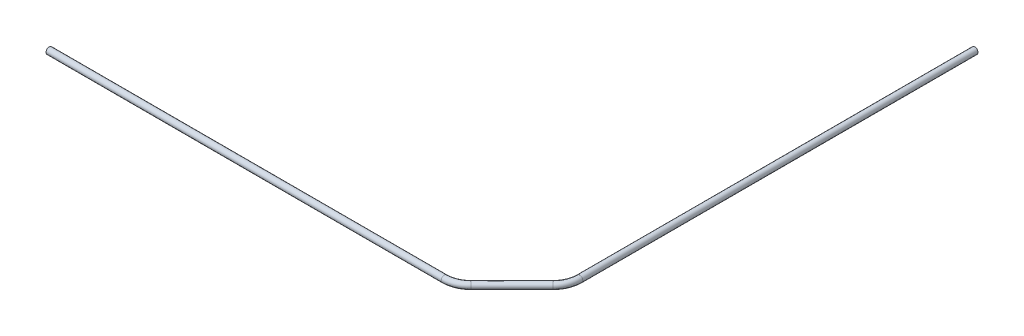
ISO-10303-21;
HEADER;
FILE_DESCRIPTION(('STEP AP214'),'2;1');
FILE_NAME('part.step','',(''),(''),'','','');
FILE_SCHEMA(('AUTOMOTIVE_DESIGN { 1 0 10303 214 1 1 1 1 }'));
ENDSEC;
DATA;
#1=APPLICATION_CONTEXT('core data for automotive mechanical design processes');
#2=APPLICATION_PROTOCOL_DEFINITION('international standard','automotive_design',2000,#1);
#3=PRODUCT_CONTEXT('',#1,'mechanical');
#4=PRODUCT('Part','Part','',(#3));
#5=PRODUCT_RELATED_PRODUCT_CATEGORY('part','',(#4));
#6=PRODUCT_DEFINITION_FORMATION('','',#4);
#7=PRODUCT_DEFINITION_CONTEXT('part definition',#1,'design');
#8=PRODUCT_DEFINITION('design','',#6,#7);
#9=PRODUCT_DEFINITION_SHAPE('','',#8);
#10=(LENGTH_UNIT() NAMED_UNIT(*) SI_UNIT(.MILLI.,.METRE.));
#11=(NAMED_UNIT(*) PLANE_ANGLE_UNIT() SI_UNIT($,.RADIAN.));
#12=(NAMED_UNIT(*) SI_UNIT($,.STERADIAN.) SOLID_ANGLE_UNIT());
#13=UNCERTAINTY_MEASURE_WITH_UNIT(LENGTH_MEASURE(1.E-05),#10,'distance_accuracy_value','');
#14=(GEOMETRIC_REPRESENTATION_CONTEXT(3) GLOBAL_UNCERTAINTY_ASSIGNED_CONTEXT((#13)) GLOBAL_UNIT_ASSIGNED_CONTEXT((#10,
#11,#12)) REPRESENTATION_CONTEXT('',''));
#15=CARTESIAN_POINT('',(0.,0.,0.));
#16=DIRECTION('',(0.,0.,1.));
#17=DIRECTION('',(1.,0.,0.));
#18=AXIS2_PLACEMENT_3D('',#15,#16,#17);
#19=CARTESIAN_POINT('',(-850.000000000001,0.,18.0000000000005));
#20=DIRECTION('',(1.,0.,0.));
#21=DIRECTION('',(0.,0.,-1.));
#22=AXIS2_PLACEMENT_3D('',#19,#20,#21);
#23=PLANE('',#22);
#24=CARTESIAN_POINT('',(-850.000000000001,0.,18.0000000000005));
#25=DIRECTION('',(1.,0.,0.));
#26=DIRECTION('',(0.,0.,-1.));
#27=AXIS2_PLACEMENT_3D('',#24,#25,#26);
#28=CIRCLE('',#27,6.);
#29=CARTESIAN_POINT('',(-850.000000000001,0.,12.0000000000005));
#30=VERTEX_POINT('',#29);
#31=EDGE_CURVE('E55',#30,#30,#28,.T.);
#32=ORIENTED_EDGE('',*,*,#31,.F.);
#33=EDGE_LOOP('',(#32));
#34=FACE_BOUND('',#33,.T.);
#35=ADVANCED_FACE('F33',(#34),#23,.F.);
#36=CARTESIAN_POINT('',(18.0000000000005,0.,-850.000000000001));
#37=DIRECTION('',(0.,0.,-1.));
#38=DIRECTION('',(-1.,0.,0.));
#39=AXIS2_PLACEMENT_3D('',#36,#37,#38);
#40=PLANE('',#39);
#41=CARTESIAN_POINT('',(18.0000000000005,0.,-850.000000000001));
#42=DIRECTION('',(0.,0.,-1.));
#43=DIRECTION('',(-1.,0.,0.));
#44=AXIS2_PLACEMENT_3D('',#41,#42,#43);
#45=CIRCLE('',#44,6.);
#46=CARTESIAN_POINT('',(12.0000000000005,0.,-850.000000000001));
#47=VERTEX_POINT('',#46);
#48=EDGE_CURVE('E10',#47,#47,#45,.T.);
#49=ORIENTED_EDGE('',*,*,#48,.T.);
#50=EDGE_LOOP('',(#49));
#51=FACE_BOUND('',#50,.T.);
#52=ADVANCED_FACE('F62',(#51),#40,.T.);
#53=CARTESIAN_POINT('',(-850.000000000001,0.,18.0000000000005));
#54=DIRECTION('',(1.,0.,0.));
#55=DIRECTION('',(0.,0.,-1.));
#56=AXIS2_PLACEMENT_3D('',#53,#54,#55);
#57=CYLINDRICAL_SURFACE('',#56,6.);
#58=CARTESIAN_POINT('',(-108.776695296636,0.,18.0000000000005));
#59=DIRECTION('',(1.,0.,0.));
#60=DIRECTION('',(0.,0.,-1.));
#61=AXIS2_PLACEMENT_3D('',#58,#59,#60);
#62=CIRCLE('',#61,6.);
#63=CARTESIAN_POINT('',(-108.776695296636,0.,24.0000000000005));
#64=VERTEX_POINT('',#63);
#65=EDGE_CURVE('E52',#64,#64,#62,.T.);
#66=ORIENTED_EDGE('',*,*,#65,.F.);
#67=EDGE_LOOP('',(#66));
#68=FACE_BOUND('',#67,.T.);
#69=ORIENTED_EDGE('',*,*,#31,.T.);
#70=EDGE_LOOP('',(#69));
#71=FACE_BOUND('',#70,.T.);
#72=ADVANCED_FACE('F59',(#68,#71),#57,.T.);
#73=CARTESIAN_POINT('',(-108.776695296636,0.,-31.9999999999995));
#74=DIRECTION('',(0.,1.,0.));
#75=DIRECTION('',(0.,0.,1.));
#76=AXIS2_PLACEMENT_3D('',#73,#74,#75);
#77=TOROIDAL_SURFACE('',#76,50.,6.);
#78=CARTESIAN_POINT('',(-73.4213562373089,0.,3.35533905932783));
#79=DIRECTION('',(0.707106781186547,0.,-0.707106781186548));
#80=DIRECTION('',(-0.707106781186548,0.,-0.707106781186547));
#81=AXIS2_PLACEMENT_3D('',#78,#79,#80);
#82=CIRCLE('',#81,6.);
#83=CARTESIAN_POINT('',(-69.1787155501897,0.,7.59797974644712));
#84=VERTEX_POINT('',#83);
#85=EDGE_CURVE('E47',#84,#84,#82,.T.);
#86=CARTESIAN_POINT('',(-108.776695296636,0.,-31.9999999999995));
#87=DIRECTION('',(0.,1.,0.));
#88=DIRECTION('',(0.,0.,1.));
#89=AXIS2_PLACEMENT_3D('',#86,#87,#88);
#90=CIRCLE('',#89,56.);
#91=EDGE_CURVE('',#64,#84,#90,.T.);
#92=ORIENTED_EDGE('',*,*,#65,.T.);
#93=ORIENTED_EDGE('',*,*,#85,.F.);
#94=ORIENTED_EDGE('',*,*,#91,.T.);
#95=ORIENTED_EDGE('',*,*,#91,.F.);
#96=EDGE_LOOP('',(#92,#94,#93,#95));
#97=FACE_BOUND('',#96,.T.);
#98=ADVANCED_FACE('F80',(#97),#77,.T.);
#99=CARTESIAN_POINT('',(-73.4213562373089,0.,3.35533905932783));
#100=DIRECTION('',(0.707106781186547,0.,-0.707106781186548));
#101=DIRECTION('',(-0.707106781186548,0.,-0.707106781186547));
#102=AXIS2_PLACEMENT_3D('',#99,#100,#101);
#103=CYLINDRICAL_SURFACE('',#102,6.);
#104=CARTESIAN_POINT('',(3.35533905932783,0.,-73.4213562373091));
#105=DIRECTION('',(0.707106781186547,0.,-0.707106781186548));
#106=DIRECTION('',(-0.707106781186548,0.,-0.707106781186547));
#107=AXIS2_PLACEMENT_3D('',#104,#105,#106);
#108=CIRCLE('',#107,6.);
#109=CARTESIAN_POINT('',(7.59797974644717,0.,-69.1787155501897));
#110=VERTEX_POINT('',#109);
#111=EDGE_CURVE('E43',#110,#110,#108,.T.);
#112=ORIENTED_EDGE('',*,*,#111,.F.);
#113=EDGE_LOOP('',(#112));
#114=FACE_BOUND('',#113,.T.);
#115=ORIENTED_EDGE('',*,*,#85,.T.);
#116=EDGE_LOOP('',(#115));
#117=FACE_BOUND('',#116,.T.);
#118=ADVANCED_FACE('F74',(#114,#117),#103,.T.);
#119=CARTESIAN_POINT('',(-31.9999999999995,0.,-108.776695296636));
#120=DIRECTION('',(0.,1.,0.));
#121=DIRECTION('',(0.,0.,1.));
#122=AXIS2_PLACEMENT_3D('',#119,#120,#121);
#123=TOROIDAL_SURFACE('',#122,50.,6.);
#124=CARTESIAN_POINT('',(18.0000000000005,0.,-108.776695296636));
#125=DIRECTION('',(0.,0.,-1.));
#126=DIRECTION('',(-1.,0.,0.));
#127=AXIS2_PLACEMENT_3D('',#124,#125,#126);
#128=CIRCLE('',#127,6.);
#129=CARTESIAN_POINT('',(24.0000000000005,0.,-108.776695296636));
#130=VERTEX_POINT('',#129);
#131=EDGE_CURVE('E39',#130,#130,#128,.T.);
#132=CARTESIAN_POINT('',(-31.9999999999995,0.,-108.776695296636));
#133=DIRECTION('',(0.,1.,0.));
#134=DIRECTION('',(0.,0.,1.));
#135=AXIS2_PLACEMENT_3D('',#132,#133,#134);
#136=CIRCLE('',#135,56.);
#137=EDGE_CURVE('',#110,#130,#136,.T.);
#138=ORIENTED_EDGE('',*,*,#111,.T.);
#139=ORIENTED_EDGE('',*,*,#131,.F.);
#140=ORIENTED_EDGE('',*,*,#137,.T.);
#141=ORIENTED_EDGE('',*,*,#137,.F.);
#142=EDGE_LOOP('',(#138,#140,#139,#141));
#143=FACE_BOUND('',#142,.T.);
#144=ADVANCED_FACE('F68',(#143),#123,.T.);
#145=CARTESIAN_POINT('',(18.0000000000005,0.,-108.776695296636));
#146=DIRECTION('',(0.,0.,-1.));
#147=DIRECTION('',(-1.,0.,0.));
#148=AXIS2_PLACEMENT_3D('',#145,#146,#147);
#149=CYLINDRICAL_SURFACE('',#148,6.);
#150=ORIENTED_EDGE('',*,*,#48,.F.);
#151=EDGE_LOOP('',(#150));
#152=FACE_BOUND('',#151,.T.);
#153=ORIENTED_EDGE('',*,*,#131,.T.);
#154=EDGE_LOOP('',(#153));
#155=FACE_BOUND('',#154,.T.);
#156=ADVANCED_FACE('F66',(#152,#155),#149,.T.);
#157=CLOSED_SHELL('',(#35,#52,#72,#98,#118,#144,#156));
#158=MANIFOLD_SOLID_BREP('B2',#157);
#159=ADVANCED_BREP_SHAPE_REPRESENTATION('',(#18,#158),#14);
#160=SHAPE_DEFINITION_REPRESENTATION(#9,#159);
ENDSEC;
END-ISO-10303-21;
